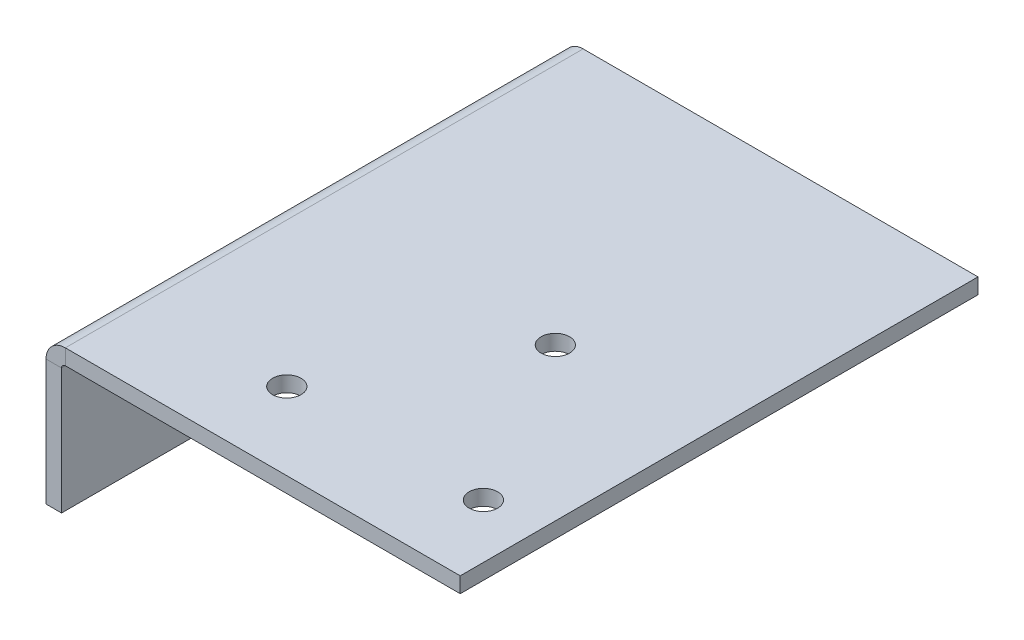
ISO-10303-21;
HEADER;
FILE_DESCRIPTION(('STEP AP214'),'2;1');
FILE_NAME('part.step','',(''),(''),'','','');
FILE_SCHEMA(('AUTOMOTIVE_DESIGN { 1 0 10303 214 1 1 1 1 }'));
ENDSEC;
DATA;
#1=APPLICATION_CONTEXT('core data for automotive mechanical design processes');
#2=APPLICATION_PROTOCOL_DEFINITION('international standard','automotive_design',2000,#1);
#3=PRODUCT_CONTEXT('',#1,'mechanical');
#4=PRODUCT('Part','Part','',(#3));
#5=PRODUCT_RELATED_PRODUCT_CATEGORY('part','',(#4));
#6=PRODUCT_DEFINITION_FORMATION('','',#4);
#7=PRODUCT_DEFINITION_CONTEXT('part definition',#1,'design');
#8=PRODUCT_DEFINITION('design','',#6,#7);
#9=PRODUCT_DEFINITION_SHAPE('','',#8);
#10=(LENGTH_UNIT() NAMED_UNIT(*) SI_UNIT(.MILLI.,.METRE.));
#11=(NAMED_UNIT(*) PLANE_ANGLE_UNIT() SI_UNIT($,.RADIAN.));
#12=(NAMED_UNIT(*) SI_UNIT($,.STERADIAN.) SOLID_ANGLE_UNIT());
#13=UNCERTAINTY_MEASURE_WITH_UNIT(LENGTH_MEASURE(1.E-05),#10,'distance_accuracy_value','');
#14=(GEOMETRIC_REPRESENTATION_CONTEXT(3) GLOBAL_UNCERTAINTY_ASSIGNED_CONTEXT((#13)) GLOBAL_UNIT_ASSIGNED_CONTEXT((#10,
#11,#12)) REPRESENTATION_CONTEXT('',''));
#15=CARTESIAN_POINT('',(0.,0.,0.));
#16=DIRECTION('',(0.,0.,1.));
#17=DIRECTION('',(1.,0.,0.));
#18=AXIS2_PLACEMENT_3D('',#15,#16,#17);
#19=CARTESIAN_POINT('',(0.,-28.,0.));
#20=DIRECTION('',(0.,0.,1.));
#21=DIRECTION('',(1.,0.,0.));
#22=AXIS2_PLACEMENT_3D('',#19,#20,#21);
#23=PLANE('',#22);
#24=DIRECTION('',(-1.,0.,0.));
#25=VECTOR('',#24,1.);
#26=CARTESIAN_POINT('',(3.,-3.73660000000002,0.));
#27=LINE('',#26,#25);
#28=CARTESIAN_POINT('',(3.,-3.7366,0.));
#29=VERTEX_POINT('',#28);
#30=CARTESIAN_POINT('',(0.,-3.73660000000001,0.));
#31=VERTEX_POINT('',#30);
#32=EDGE_CURVE('E152',#29,#31,#27,.T.);
#33=ORIENTED_EDGE('',*,*,#32,.F.);
#34=DIRECTION('',(0.,1.,0.));
#35=VECTOR('',#34,1.);
#36=CARTESIAN_POINT('',(2.99999999999992,-28.,0.));
#37=LINE('',#36,#35);
#38=CARTESIAN_POINT('',(2.99999999999992,-28.,0.));
#39=VERTEX_POINT('',#38);
#40=EDGE_CURVE('E154',#29,#39,#37,.F.);
#41=ORIENTED_EDGE('',*,*,#40,.T.);
#42=DIRECTION('',(1.,0.,0.));
#43=VECTOR('',#42,1.);
#44=CARTESIAN_POINT('',(0.,-28.,0.));
#45=LINE('',#44,#43);
#46=CARTESIAN_POINT('',(0.,-28.,0.));
#47=VERTEX_POINT('',#46);
#48=EDGE_CURVE('E178',#47,#39,#45,.T.);
#49=ORIENTED_EDGE('',*,*,#48,.F.);
#50=DIRECTION('',(0.,-1.,0.));
#51=VECTOR('',#50,1.);
#52=CARTESIAN_POINT('',(0.,0.,0.));
#53=LINE('',#52,#51);
#54=EDGE_CURVE('E88',#31,#47,#53,.T.);
#55=ORIENTED_EDGE('',*,*,#54,.F.);
#56=EDGE_LOOP('',(#33,#41,#49,#55));
#57=FACE_BOUND('',#56,.T.);
#58=ADVANCED_FACE('F67',(#57),#23,.F.);
#59=CARTESIAN_POINT('',(0.,-3.00000000000002,100.));
#60=DIRECTION('',(0.,0.,-1.));
#61=DIRECTION('',(-1.,0.,0.));
#62=AXIS2_PLACEMENT_3D('',#59,#60,#61);
#63=PLANE('',#62);
#64=DIRECTION('',(-1.,0.,0.));
#65=VECTOR('',#64,1.);
#66=CARTESIAN_POINT('',(0.,-3.73660000000001,100.));
#67=LINE('',#66,#65);
#68=CARTESIAN_POINT('',(3.00000000000001,-3.73660000000002,100.));
#69=VERTEX_POINT('',#68);
#70=CARTESIAN_POINT('',(0.,-3.73660000000001,99.9999999999999));
#71=VERTEX_POINT('',#70);
#72=EDGE_CURVE('E13',#69,#71,#67,.T.);
#73=ORIENTED_EDGE('',*,*,#72,.T.);
#74=DIRECTION('',(0.,1.,0.));
#75=VECTOR('',#74,1.);
#76=CARTESIAN_POINT('',(0.,0.,100.));
#77=LINE('',#76,#75);
#78=CARTESIAN_POINT('',(0.,-28.,100.));
#79=VERTEX_POINT('',#78);
#80=EDGE_CURVE('E81',#79,#71,#77,.T.);
#81=ORIENTED_EDGE('',*,*,#80,.F.);
#82=DIRECTION('',(1.,0.,0.));
#83=VECTOR('',#82,1.);
#84=CARTESIAN_POINT('',(0.,-28.,100.));
#85=LINE('',#84,#83);
#86=CARTESIAN_POINT('',(2.99999999999993,-28.,100.));
#87=VERTEX_POINT('',#86);
#88=EDGE_CURVE('E270',#79,#87,#85,.T.);
#89=ORIENTED_EDGE('',*,*,#88,.T.);
#90=DIRECTION('',(0.,-1.,0.));
#91=VECTOR('',#90,1.);
#92=CARTESIAN_POINT('',(3.00000000000002,-3.00000000000003,100.));
#93=LINE('',#92,#91);
#94=EDGE_CURVE('E277',#87,#69,#93,.F.);
#95=ORIENTED_EDGE('',*,*,#94,.T.);
#96=EDGE_LOOP('',(#73,#81,#89,#95));
#97=FACE_BOUND('',#96,.T.);
#98=ADVANCED_FACE('F321',(#97),#63,.F.);
#99=CARTESIAN_POINT('',(0.,0.,0.));
#100=DIRECTION('',(1.,0.,0.));
#101=DIRECTION('',(0.,1.,0.));
#102=AXIS2_PLACEMENT_3D('',#99,#100,#101);
#103=PLANE('',#102);
#104=DIRECTION('',(0.,0.,1.));
#105=VECTOR('',#104,1.);
#106=CARTESIAN_POINT('',(0.,-9.00000000000001,0.));
#107=LINE('',#106,#105);
#108=CARTESIAN_POINT('',(0.,-9.00000000000002,20.));
#109=VERTEX_POINT('',#108);
#110=CARTESIAN_POINT('',(0.,-9.00000000000003,80.));
#111=VERTEX_POINT('',#110);
#112=EDGE_CURVE('E264',#109,#111,#107,.T.);
#113=ORIENTED_EDGE('',*,*,#112,.T.);
#114=CARTESIAN_POINT('',(0.,-13.,80.));
#115=DIRECTION('',(1.,0.,0.));
#116=DIRECTION('',(0.,1.,0.));
#117=AXIS2_PLACEMENT_3D('',#114,#115,#116);
#118=CIRCLE('',#117,4.);
#119=CARTESIAN_POINT('',(0.,-17.,80.));
#120=VERTEX_POINT('',#119);
#121=EDGE_CURVE('E168',#111,#120,#118,.T.);
#122=ORIENTED_EDGE('',*,*,#121,.T.);
#123=DIRECTION('',(0.,0.,-1.));
#124=VECTOR('',#123,1.);
#125=CARTESIAN_POINT('',(0.,-17.,0.));
#126=LINE('',#125,#124);
#127=CARTESIAN_POINT('',(0.,-17.,20.));
#128=VERTEX_POINT('',#127);
#129=EDGE_CURVE('E252',#120,#128,#126,.T.);
#130=ORIENTED_EDGE('',*,*,#129,.T.);
#131=CARTESIAN_POINT('',(0.,-13.,20.));
#132=DIRECTION('',(1.,0.,0.));
#133=DIRECTION('',(0.,1.,0.));
#134=AXIS2_PLACEMENT_3D('',#131,#132,#133);
#135=CIRCLE('',#134,4.);
#136=EDGE_CURVE('E261',#128,#109,#135,.T.);
#137=ORIENTED_EDGE('',*,*,#136,.T.);
#138=EDGE_LOOP('',(#113,#122,#130,#137));
#139=FACE_BOUND('',#138,.T.);
#140=DIRECTION('',(0.,0.,1.));
#141=VECTOR('',#140,1.);
#142=CARTESIAN_POINT('',(0.,-3.73660000000001,100.));
#143=LINE('',#142,#141);
#144=EDGE_CURVE('E74',#31,#71,#143,.T.);
#145=ORIENTED_EDGE('',*,*,#144,.F.);
#146=ORIENTED_EDGE('',*,*,#54,.T.);
#147=DIRECTION('',(0.,0.,1.));
#148=VECTOR('',#147,1.);
#149=CARTESIAN_POINT('',(0.,-28.,0.));
#150=LINE('',#149,#148);
#151=EDGE_CURVE('E274',#47,#79,#150,.T.);
#152=ORIENTED_EDGE('',*,*,#151,.T.);
#153=ORIENTED_EDGE('',*,*,#80,.T.);
#154=EDGE_LOOP('',(#145,#146,#152,#153));
#155=FACE_BOUND('',#154,.T.);
#156=ADVANCED_FACE('F325',(#139,#155),#103,.F.);
#157=CARTESIAN_POINT('',(3.00000000000001,0.,0.));
#158=DIRECTION('',(1.,0.,0.));
#159=DIRECTION('',(0.,1.,0.));
#160=AXIS2_PLACEMENT_3D('',#157,#158,#159);
#161=PLANE('',#160);
#162=CARTESIAN_POINT('',(2.99999999999998,-13.,80.));
#163=DIRECTION('',(1.,0.,0.));
#164=DIRECTION('',(0.,1.,0.));
#165=AXIS2_PLACEMENT_3D('',#162,#163,#164);
#166=CIRCLE('',#165,4.);
#167=CARTESIAN_POINT('',(2.99999999999999,-9.00000000000004,80.));
#168=VERTEX_POINT('',#167);
#169=CARTESIAN_POINT('',(2.99999999999996,-17.,80.));
#170=VERTEX_POINT('',#169);
#171=EDGE_CURVE('E195',#168,#170,#166,.T.);
#172=ORIENTED_EDGE('',*,*,#171,.F.);
#173=DIRECTION('',(0.,0.,1.));
#174=VECTOR('',#173,1.);
#175=CARTESIAN_POINT('',(2.99999999999999,-9.00000000000004,80.));
#176=LINE('',#175,#174);
#177=CARTESIAN_POINT('',(2.99999999999999,-9.00000000000003,20.));
#178=VERTEX_POINT('',#177);
#179=EDGE_CURVE('E246',#178,#168,#176,.T.);
#180=ORIENTED_EDGE('',*,*,#179,.F.);
#181=CARTESIAN_POINT('',(2.99999999999997,-13.,20.));
#182=DIRECTION('',(1.,0.,0.));
#183=DIRECTION('',(0.,1.,0.));
#184=AXIS2_PLACEMENT_3D('',#181,#182,#183);
#185=CIRCLE('',#184,4.);
#186=CARTESIAN_POINT('',(2.99999999999996,-17.,20.));
#187=VERTEX_POINT('',#186);
#188=EDGE_CURVE('E243',#187,#178,#185,.T.);
#189=ORIENTED_EDGE('',*,*,#188,.F.);
#190=DIRECTION('',(0.,0.,-1.));
#191=VECTOR('',#190,1.);
#192=CARTESIAN_POINT('',(2.99999999999996,-17.,80.));
#193=LINE('',#192,#191);
#194=EDGE_CURVE('E240',#170,#187,#193,.T.);
#195=ORIENTED_EDGE('',*,*,#194,.F.);
#196=EDGE_LOOP('',(#172,#180,#189,#195));
#197=FACE_BOUND('',#196,.T.);
#198=ORIENTED_EDGE('',*,*,#40,.F.);
#199=DIRECTION('',(0.,0.,-1.));
#200=VECTOR('',#199,1.);
#201=CARTESIAN_POINT('',(3.00000000000001,-3.73660000000002,100.));
#202=LINE('',#201,#200);
#203=EDGE_CURVE('E159',#69,#29,#202,.T.);
#204=ORIENTED_EDGE('',*,*,#203,.F.);
#205=ORIENTED_EDGE('',*,*,#94,.F.);
#206=DIRECTION('',(0.,0.,-1.));
#207=VECTOR('',#206,1.);
#208=CARTESIAN_POINT('',(2.99999999999993,-28.,100.));
#209=LINE('',#208,#207);
#210=EDGE_CURVE('E166',#39,#87,#209,.F.);
#211=ORIENTED_EDGE('',*,*,#210,.F.);
#212=EDGE_LOOP('',(#198,#204,#205,#211));
#213=FACE_BOUND('',#212,.T.);
#214=ADVANCED_FACE('F163',(#197,#213),#161,.T.);
#215=CARTESIAN_POINT('',(0.,-28.,100.));
#216=DIRECTION('',(0.,1.,0.));
#217=DIRECTION('',(-1.,0.,0.));
#218=AXIS2_PLACEMENT_3D('',#215,#216,#217);
#219=PLANE('',#218);
#220=ORIENTED_EDGE('',*,*,#210,.T.);
#221=ORIENTED_EDGE('',*,*,#88,.F.);
#222=ORIENTED_EDGE('',*,*,#151,.F.);
#223=ORIENTED_EDGE('',*,*,#48,.T.);
#224=EDGE_LOOP('',(#220,#221,#222,#223));
#225=FACE_BOUND('',#224,.T.);
#226=ADVANCED_FACE('F334',(#225),#219,.F.);
#227=CARTESIAN_POINT('',(-7.00000000000002,-13.,80.));
#228=DIRECTION('',(1.,0.,0.));
#229=DIRECTION('',(0.,1.,0.));
#230=AXIS2_PLACEMENT_3D('',#227,#228,#229);
#231=CYLINDRICAL_SURFACE('',#230,4.);
#232=DIRECTION('',(1.,0.,0.));
#233=VECTOR('',#232,1.);
#234=CARTESIAN_POINT('',(-7.00000000000001,-9.00000000000001,80.));
#235=LINE('',#234,#233);
#236=EDGE_CURVE('E250',#111,#168,#235,.T.);
#237=ORIENTED_EDGE('',*,*,#236,.T.);
#238=ORIENTED_EDGE('',*,*,#171,.T.);
#239=DIRECTION('',(1.,0.,0.));
#240=VECTOR('',#239,1.);
#241=CARTESIAN_POINT('',(-7.00000000000004,-17.,80.));
#242=LINE('',#241,#240);
#243=EDGE_CURVE('E249',#120,#170,#242,.T.);
#244=ORIENTED_EDGE('',*,*,#243,.F.);
#245=ORIENTED_EDGE('',*,*,#121,.F.);
#246=EDGE_LOOP('',(#237,#238,#244,#245));
#247=FACE_BOUND('',#246,.T.);
#248=ADVANCED_FACE('F336',(#247),#231,.F.);
#249=CARTESIAN_POINT('',(-7.00000000000001,-9.00000000000001,80.));
#250=DIRECTION('',(0.,1.,0.));
#251=DIRECTION('',(-1.,0.,0.));
#252=AXIS2_PLACEMENT_3D('',#249,#250,#251);
#253=PLANE('',#252);
#254=DIRECTION('',(1.,0.,0.));
#255=VECTOR('',#254,1.);
#256=CARTESIAN_POINT('',(-7.00000000000002,-8.99999999999999,20.));
#257=LINE('',#256,#255);
#258=EDGE_CURVE('E253',#109,#178,#257,.T.);
#259=ORIENTED_EDGE('',*,*,#258,.T.);
#260=ORIENTED_EDGE('',*,*,#179,.T.);
#261=ORIENTED_EDGE('',*,*,#236,.F.);
#262=ORIENTED_EDGE('',*,*,#112,.F.);
#263=EDGE_LOOP('',(#259,#260,#261,#262));
#264=FACE_BOUND('',#263,.T.);
#265=ADVANCED_FACE('F342',(#264),#253,.F.);
#266=CARTESIAN_POINT('',(-7.00000000000003,-13.,20.));
#267=DIRECTION('',(1.,0.,0.));
#268=DIRECTION('',(0.,1.,0.));
#269=AXIS2_PLACEMENT_3D('',#266,#267,#268);
#270=CYLINDRICAL_SURFACE('',#269,4.);
#271=DIRECTION('',(1.,0.,0.));
#272=VECTOR('',#271,1.);
#273=CARTESIAN_POINT('',(-7.00000000000004,-17.,20.));
#274=LINE('',#273,#272);
#275=EDGE_CURVE('E255',#128,#187,#274,.T.);
#276=ORIENTED_EDGE('',*,*,#275,.T.);
#277=ORIENTED_EDGE('',*,*,#188,.T.);
#278=ORIENTED_EDGE('',*,*,#258,.F.);
#279=ORIENTED_EDGE('',*,*,#136,.F.);
#280=EDGE_LOOP('',(#276,#277,#278,#279));
#281=FACE_BOUND('',#280,.T.);
#282=ADVANCED_FACE('F316',(#281),#270,.F.);
#283=CARTESIAN_POINT('',(-7.00000000000004,-17.,80.));
#284=DIRECTION('',(0.,-1.,0.));
#285=DIRECTION('',(1.,0.,0.));
#286=AXIS2_PLACEMENT_3D('',#283,#284,#285);
#287=PLANE('',#286);
#288=ORIENTED_EDGE('',*,*,#243,.T.);
#289=ORIENTED_EDGE('',*,*,#194,.T.);
#290=ORIENTED_EDGE('',*,*,#275,.F.);
#291=ORIENTED_EDGE('',*,*,#129,.F.);
#292=EDGE_LOOP('',(#288,#289,#290,#291));
#293=FACE_BOUND('',#292,.T.);
#294=ADVANCED_FACE('F307',(#293),#287,.F.);
#295=CARTESIAN_POINT('',(80.,-3.,0.));
#296=DIRECTION('',(1.,0.,0.));
#297=DIRECTION('',(0.,0.,-1.));
#298=AXIS2_PLACEMENT_3D('',#295,#296,#297);
#299=PLANE('',#298);
#300=DIRECTION('',(0.,0.,-1.));
#301=VECTOR('',#300,1.);
#302=CARTESIAN_POINT('',(80.,0.,0.));
#303=LINE('',#302,#301);
#304=CARTESIAN_POINT('',(80.,0.,100.));
#305=VERTEX_POINT('',#304);
#306=CARTESIAN_POINT('',(80.,0.,0.));
#307=VERTEX_POINT('',#306);
#308=EDGE_CURVE('E198',#305,#307,#303,.T.);
#309=ORIENTED_EDGE('',*,*,#308,.F.);
#310=DIRECTION('',(0.,1.,0.));
#311=VECTOR('',#310,1.);
#312=CARTESIAN_POINT('',(80.,-3.,100.));
#313=LINE('',#312,#311);
#314=CARTESIAN_POINT('',(80.,-3.,100.));
#315=VERTEX_POINT('',#314);
#316=EDGE_CURVE('E192',#315,#305,#313,.T.);
#317=ORIENTED_EDGE('',*,*,#316,.F.);
#318=DIRECTION('',(0.,0.,-1.));
#319=VECTOR('',#318,1.);
#320=CARTESIAN_POINT('',(80.,-3.,0.));
#321=LINE('',#320,#319);
#322=CARTESIAN_POINT('',(80.,-3.,0.));
#323=VERTEX_POINT('',#322);
#324=EDGE_CURVE('E233',#315,#323,#321,.T.);
#325=ORIENTED_EDGE('',*,*,#324,.T.);
#326=DIRECTION('',(0.,1.,0.));
#327=VECTOR('',#326,1.);
#328=CARTESIAN_POINT('',(80.,-3.,0.));
#329=LINE('',#328,#327);
#330=EDGE_CURVE('E231',#323,#307,#329,.T.);
#331=ORIENTED_EDGE('',*,*,#330,.T.);
#332=EDGE_LOOP('',(#309,#317,#325,#331));
#333=FACE_BOUND('',#332,.T.);
#334=ADVANCED_FACE('F304',(#333),#299,.T.);
#335=CARTESIAN_POINT('',(31.5849159682208,-3.,85.0774418486017));
#336=DIRECTION('',(0.,1.,0.));
#337=DIRECTION('',(0.,0.,1.));
#338=AXIS2_PLACEMENT_3D('',#335,#336,#337);
#339=CYLINDRICAL_SURFACE('',#338,2.74999999999999);
#340=CARTESIAN_POINT('',(31.5849159682208,-3.,85.0774418486017));
#341=DIRECTION('',(0.,1.,0.));
#342=DIRECTION('',(0.,0.,1.));
#343=AXIS2_PLACEMENT_3D('',#340,#341,#342);
#344=CIRCLE('',#343,2.74999999999999);
#345=CARTESIAN_POINT('',(31.5849159682208,-3.,87.8274418486017));
#346=VERTEX_POINT('',#345);
#347=EDGE_CURVE('E213',#346,#346,#344,.T.);
#348=ORIENTED_EDGE('',*,*,#347,.F.);
#349=EDGE_LOOP('',(#348));
#350=FACE_BOUND('',#349,.T.);
#351=CARTESIAN_POINT('',(31.5849159682208,0.,85.0774418486017));
#352=DIRECTION('',(0.,1.,0.));
#353=DIRECTION('',(0.,0.,1.));
#354=AXIS2_PLACEMENT_3D('',#351,#352,#353);
#355=CIRCLE('',#354,2.74999999999999);
#356=CARTESIAN_POINT('',(31.5849159682208,0.,87.8274418486017));
#357=VERTEX_POINT('',#356);
#358=EDGE_CURVE('E228',#357,#357,#355,.T.);
#359=ORIENTED_EDGE('',*,*,#358,.T.);
#360=EDGE_LOOP('',(#359));
#361=FACE_BOUND('',#360,.T.);
#362=ADVANCED_FACE('F306',(#350,#361),#339,.F.);
#363=CARTESIAN_POINT('',(69.5514696701306,-3.,85.0774418495537));
#364=DIRECTION('',(0.,1.,0.));
#365=DIRECTION('',(0.,0.,1.));
#366=AXIS2_PLACEMENT_3D('',#363,#364,#365);
#367=CYLINDRICAL_SURFACE('',#366,2.75);
#368=CARTESIAN_POINT('',(69.5514696701306,-3.,85.0774418495537));
#369=DIRECTION('',(0.,1.,0.));
#370=DIRECTION('',(0.,0.,1.));
#371=AXIS2_PLACEMENT_3D('',#368,#369,#370);
#372=CIRCLE('',#371,2.75);
#373=CARTESIAN_POINT('',(69.5514696701306,-3.,87.8274418495537));
#374=VERTEX_POINT('',#373);
#375=EDGE_CURVE('E216',#374,#374,#372,.T.);
#376=ORIENTED_EDGE('',*,*,#375,.F.);
#377=EDGE_LOOP('',(#376));
#378=FACE_BOUND('',#377,.T.);
#379=CARTESIAN_POINT('',(69.5514696701306,0.,85.0774418495537));
#380=DIRECTION('',(0.,1.,0.));
#381=DIRECTION('',(0.,0.,1.));
#382=AXIS2_PLACEMENT_3D('',#379,#380,#381);
#383=CIRCLE('',#382,2.75);
#384=CARTESIAN_POINT('',(69.5514696701306,0.,87.8274418495537));
#385=VERTEX_POINT('',#384);
#386=EDGE_CURVE('E225',#385,#385,#383,.T.);
#387=ORIENTED_EDGE('',*,*,#386,.T.);
#388=EDGE_LOOP('',(#387));
#389=FACE_BOUND('',#388,.T.);
#390=ADVANCED_FACE('F313',(#378,#389),#367,.F.);
#391=CARTESIAN_POINT('',(50.56819282,-3.,52.1974418490778));
#392=DIRECTION('',(0.,1.,0.));
#393=DIRECTION('',(0.,0.,1.));
#394=AXIS2_PLACEMENT_3D('',#391,#392,#393);
#395=CYLINDRICAL_SURFACE('',#394,2.74999999999999);
#396=CARTESIAN_POINT('',(50.56819282,-3.,52.1974418490778));
#397=DIRECTION('',(0.,1.,0.));
#398=DIRECTION('',(0.,0.,1.));
#399=AXIS2_PLACEMENT_3D('',#396,#397,#398);
#400=CIRCLE('',#399,2.74999999999999);
#401=CARTESIAN_POINT('',(50.56819282,-3.,54.9474418490778));
#402=VERTEX_POINT('',#401);
#403=EDGE_CURVE('E219',#402,#402,#400,.T.);
#404=ORIENTED_EDGE('',*,*,#403,.F.);
#405=EDGE_LOOP('',(#404));
#406=FACE_BOUND('',#405,.T.);
#407=CARTESIAN_POINT('',(50.56819282,0.,52.1974418490778));
#408=DIRECTION('',(0.,1.,0.));
#409=DIRECTION('',(0.,0.,1.));
#410=AXIS2_PLACEMENT_3D('',#407,#408,#409);
#411=CIRCLE('',#410,2.74999999999999);
#412=CARTESIAN_POINT('',(50.56819282,0.,54.9474418490778));
#413=VERTEX_POINT('',#412);
#414=EDGE_CURVE('E222',#413,#413,#411,.T.);
#415=ORIENTED_EDGE('',*,*,#414,.T.);
#416=EDGE_LOOP('',(#415));
#417=FACE_BOUND('',#416,.T.);
#418=ADVANCED_FACE('F376',(#406,#417),#395,.F.);
#419=CARTESIAN_POINT('',(0.,-3.,0.));
#420=DIRECTION('',(0.,1.,0.));
#421=DIRECTION('',(0.,0.,1.));
#422=AXIS2_PLACEMENT_3D('',#419,#420,#421);
#423=PLANE('',#422);
#424=ORIENTED_EDGE('',*,*,#403,.T.);
#425=EDGE_LOOP('',(#424));
#426=FACE_BOUND('',#425,.T.);
#427=ORIENTED_EDGE('',*,*,#375,.T.);
#428=EDGE_LOOP('',(#427));
#429=FACE_BOUND('',#428,.T.);
#430=ORIENTED_EDGE('',*,*,#347,.T.);
#431=EDGE_LOOP('',(#430));
#432=FACE_BOUND('',#431,.T.);
#433=DIRECTION('',(0.,0.,1.));
#434=VECTOR('',#433,1.);
#435=CARTESIAN_POINT('',(3.7366,-3.,0.));
#436=LINE('',#435,#434);
#437=CARTESIAN_POINT('',(3.7366,-3.,0.));
#438=VERTEX_POINT('',#437);
#439=CARTESIAN_POINT('',(3.7366,-3.,100.));
#440=VERTEX_POINT('',#439);
#441=EDGE_CURVE('E185',#438,#440,#436,.T.);
#442=ORIENTED_EDGE('',*,*,#441,.F.);
#443=DIRECTION('',(-1.,0.,0.));
#444=VECTOR('',#443,1.);
#445=CARTESIAN_POINT('',(0.,-3.,0.));
#446=LINE('',#445,#444);
#447=EDGE_CURVE('E210',#323,#438,#446,.T.);
#448=ORIENTED_EDGE('',*,*,#447,.F.);
#449=ORIENTED_EDGE('',*,*,#324,.F.);
#450=DIRECTION('',(1.,0.,0.));
#451=VECTOR('',#450,1.);
#452=CARTESIAN_POINT('',(0.,-3.,100.));
#453=LINE('',#452,#451);
#454=EDGE_CURVE('E196',#440,#315,#453,.T.);
#455=ORIENTED_EDGE('',*,*,#454,.F.);
#456=EDGE_LOOP('',(#442,#448,#449,#455));
#457=FACE_BOUND('',#456,.T.);
#458=ADVANCED_FACE('F302',(#426,#429,#432,#457),#423,.F.);
#459=CARTESIAN_POINT('',(0.,-3.,0.));
#460=DIRECTION('',(0.,0.,-1.));
#461=DIRECTION('',(-1.,0.,0.));
#462=AXIS2_PLACEMENT_3D('',#459,#460,#461);
#463=PLANE('',#462);
#464=ORIENTED_EDGE('',*,*,#447,.T.);
#465=DIRECTION('',(0.,1.,0.));
#466=VECTOR('',#465,1.);
#467=CARTESIAN_POINT('',(3.7366,-3.,0.));
#468=LINE('',#467,#466);
#469=CARTESIAN_POINT('',(3.73659999999997,0.,0.));
#470=VERTEX_POINT('',#469);
#471=EDGE_CURVE('E182',#438,#470,#468,.T.);
#472=ORIENTED_EDGE('',*,*,#471,.T.);
#473=DIRECTION('',(-1.,0.,0.));
#474=VECTOR('',#473,1.);
#475=CARTESIAN_POINT('',(0.,0.,0.));
#476=LINE('',#475,#474);
#477=EDGE_CURVE('E206',#307,#470,#476,.T.);
#478=ORIENTED_EDGE('',*,*,#477,.F.);
#479=ORIENTED_EDGE('',*,*,#330,.F.);
#480=EDGE_LOOP('',(#464,#472,#478,#479));
#481=FACE_BOUND('',#480,.T.);
#482=ADVANCED_FACE('F298',(#481),#463,.T.);
#483=CARTESIAN_POINT('',(0.,0.,0.));
#484=DIRECTION('',(0.,1.,0.));
#485=DIRECTION('',(0.,0.,1.));
#486=AXIS2_PLACEMENT_3D('',#483,#484,#485);
#487=PLANE('',#486);
#488=ORIENTED_EDGE('',*,*,#358,.F.);
#489=EDGE_LOOP('',(#488));
#490=FACE_BOUND('',#489,.T.);
#491=ORIENTED_EDGE('',*,*,#386,.F.);
#492=EDGE_LOOP('',(#491));
#493=FACE_BOUND('',#492,.T.);
#494=ORIENTED_EDGE('',*,*,#414,.F.);
#495=EDGE_LOOP('',(#494));
#496=FACE_BOUND('',#495,.T.);
#497=ORIENTED_EDGE('',*,*,#477,.T.);
#498=DIRECTION('',(0.,0.,1.));
#499=VECTOR('',#498,1.);
#500=CARTESIAN_POINT('',(3.73659999999997,0.,0.));
#501=LINE('',#500,#499);
#502=CARTESIAN_POINT('',(3.7366,0.,100.));
#503=VERTEX_POINT('',#502);
#504=EDGE_CURVE('E203',#470,#503,#501,.T.);
#505=ORIENTED_EDGE('',*,*,#504,.T.);
#506=DIRECTION('',(1.,0.,0.));
#507=VECTOR('',#506,1.);
#508=CARTESIAN_POINT('',(0.,0.,100.));
#509=LINE('',#508,#507);
#510=EDGE_CURVE('E201',#503,#305,#509,.T.);
#511=ORIENTED_EDGE('',*,*,#510,.T.);
#512=ORIENTED_EDGE('',*,*,#308,.T.);
#513=EDGE_LOOP('',(#497,#505,#511,#512));
#514=FACE_BOUND('',#513,.T.);
#515=ADVANCED_FACE('F295',(#490,#493,#496,#514),#487,.T.);
#516=CARTESIAN_POINT('',(0.,-3.,100.));
#517=DIRECTION('',(0.,0.,1.));
#518=DIRECTION('',(1.,0.,0.));
#519=AXIS2_PLACEMENT_3D('',#516,#517,#518);
#520=PLANE('',#519);
#521=DIRECTION('',(0.,1.,0.));
#522=VECTOR('',#521,1.);
#523=CARTESIAN_POINT('',(3.7366,-3.,100.));
#524=LINE('',#523,#522);
#525=EDGE_CURVE('E236',#440,#503,#524,.T.);
#526=ORIENTED_EDGE('',*,*,#525,.F.);
#527=ORIENTED_EDGE('',*,*,#454,.T.);
#528=ORIENTED_EDGE('',*,*,#316,.T.);
#529=ORIENTED_EDGE('',*,*,#510,.F.);
#530=EDGE_LOOP('',(#526,#527,#528,#529));
#531=FACE_BOUND('',#530,.T.);
#532=ADVANCED_FACE('F291',(#531),#520,.T.);
#533=CARTESIAN_POINT('',(3.7366,-3.73660000000001,0.));
#534=DIRECTION('',(0.,0.,1.));
#535=DIRECTION('',(1.,0.,0.));
#536=AXIS2_PLACEMENT_3D('',#533,#534,#535);
#537=PLANE('',#536);
#538=ORIENTED_EDGE('',*,*,#32,.T.);
#539=CARTESIAN_POINT('',(3.7366,-3.73660000000001,0.));
#540=DIRECTION('',(0.,0.,-1.));
#541=DIRECTION('',(-1.,0.,0.));
#542=AXIS2_PLACEMENT_3D('',#539,#540,#541);
#543=CIRCLE('',#542,3.7366);
#544=EDGE_CURVE('E188',#31,#470,#543,.T.);
#545=ORIENTED_EDGE('',*,*,#544,.T.);
#546=ORIENTED_EDGE('',*,*,#471,.F.);
#547=CARTESIAN_POINT('',(3.7366,-3.73660000000001,0.));
#548=DIRECTION('',(0.,0.,-1.));
#549=DIRECTION('',(-1.,0.,0.));
#550=AXIS2_PLACEMENT_3D('',#547,#548,#549);
#551=CIRCLE('',#550,0.7366);
#552=EDGE_CURVE('E174',#29,#438,#551,.T.);
#553=ORIENTED_EDGE('',*,*,#552,.F.);
#554=EDGE_LOOP('',(#538,#545,#546,#553));
#555=FACE_BOUND('',#554,.T.);
#556=ADVANCED_FACE('F180',(#555),#537,.F.);
#557=CARTESIAN_POINT('',(3.7366,-3.73660000000001,100.));
#558=DIRECTION('',(0.,0.,-1.));
#559=DIRECTION('',(-1.,0.,0.));
#560=AXIS2_PLACEMENT_3D('',#557,#558,#559);
#561=PLANE('',#560);
#562=CARTESIAN_POINT('',(3.7366,-3.73660000000001,100.));
#563=DIRECTION('',(0.,0.,-1.));
#564=DIRECTION('',(-1.,0.,0.));
#565=AXIS2_PLACEMENT_3D('',#562,#563,#564);
#566=CIRCLE('',#565,3.7366);
#567=EDGE_CURVE('E183',#503,#71,#566,.F.);
#568=ORIENTED_EDGE('',*,*,#567,.T.);
#569=ORIENTED_EDGE('',*,*,#72,.F.);
#570=CARTESIAN_POINT('',(3.7366,-3.73660000000001,100.));
#571=DIRECTION('',(0.,0.,1.));
#572=DIRECTION('',(1.,0.,0.));
#573=AXIS2_PLACEMENT_3D('',#570,#571,#572);
#574=CIRCLE('',#573,0.7366);
#575=EDGE_CURVE('E177',#440,#69,#574,.T.);
#576=ORIENTED_EDGE('',*,*,#575,.F.);
#577=ORIENTED_EDGE('',*,*,#525,.T.);
#578=EDGE_LOOP('',(#568,#569,#576,#577));
#579=FACE_BOUND('',#578,.T.);
#580=ADVANCED_FACE('F287',(#579),#561,.F.);
#581=CARTESIAN_POINT('',(3.7366,-3.73660000000001,150.106657505035));
#582=DIRECTION('',(0.,0.,-1.));
#583=DIRECTION('',(-1.,0.,0.));
#584=AXIS2_PLACEMENT_3D('',#581,#582,#583);
#585=CYLINDRICAL_SURFACE('',#584,0.7366);
#586=ORIENTED_EDGE('',*,*,#441,.T.);
#587=ORIENTED_EDGE('',*,*,#575,.T.);
#588=ORIENTED_EDGE('',*,*,#203,.T.);
#589=ORIENTED_EDGE('',*,*,#552,.T.);
#590=EDGE_LOOP('',(#586,#587,#588,#589));
#591=FACE_BOUND('',#590,.T.);
#592=ADVANCED_FACE('F173',(#591),#585,.F.);
#593=CARTESIAN_POINT('',(3.7366,-3.73660000000001,150.106657505035));
#594=DIRECTION('',(0.,0.,-1.));
#595=DIRECTION('',(-1.,0.,0.));
#596=AXIS2_PLACEMENT_3D('',#593,#594,#595);
#597=CYLINDRICAL_SURFACE('',#596,3.7366);
#598=ORIENTED_EDGE('',*,*,#504,.F.);
#599=ORIENTED_EDGE('',*,*,#544,.F.);
#600=ORIENTED_EDGE('',*,*,#144,.T.);
#601=ORIENTED_EDGE('',*,*,#567,.F.);
#602=EDGE_LOOP('',(#598,#599,#600,#601));
#603=FACE_BOUND('',#602,.T.);
#604=ADVANCED_FACE('F283',(#603),#597,.T.);
#605=CLOSED_SHELL('',(#58,#98,#156,#214,#226,#248,#265,#282,#294,#334,#362,#390,#418,#458,#482,
#515,#532,#556,#580,#592,#604));
#606=MANIFOLD_SOLID_BREP('B2',#605);
#607=ADVANCED_BREP_SHAPE_REPRESENTATION('',(#18,#606),#14);
#608=SHAPE_DEFINITION_REPRESENTATION(#9,#607);
ENDSEC;
END-ISO-10303-21;
